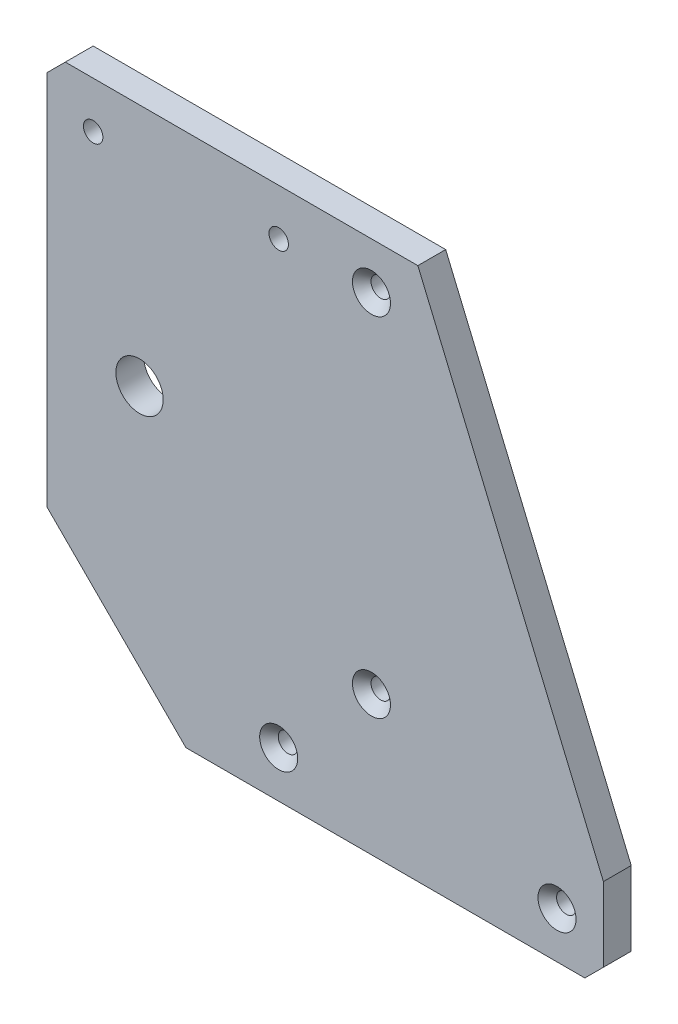
ISO-10303-21;
HEADER;
FILE_DESCRIPTION(('STEP AP214'),'2;1');
FILE_NAME('part.step','',(''),(''),'','','');
FILE_SCHEMA(('AUTOMOTIVE_DESIGN { 1 0 10303 214 1 1 1 1 }'));
ENDSEC;
DATA;
#1=APPLICATION_CONTEXT('core data for automotive mechanical design processes');
#2=APPLICATION_PROTOCOL_DEFINITION('international standard','automotive_design',2000,#1);
#3=PRODUCT_CONTEXT('',#1,'mechanical');
#4=PRODUCT('Part','Part','',(#3));
#5=PRODUCT_RELATED_PRODUCT_CATEGORY('part','',(#4));
#6=PRODUCT_DEFINITION_FORMATION('','',#4);
#7=PRODUCT_DEFINITION_CONTEXT('part definition',#1,'design');
#8=PRODUCT_DEFINITION('design','',#6,#7);
#9=PRODUCT_DEFINITION_SHAPE('','',#8);
#10=(LENGTH_UNIT() NAMED_UNIT(*) SI_UNIT(.MILLI.,.METRE.));
#11=(NAMED_UNIT(*) PLANE_ANGLE_UNIT() SI_UNIT($,.RADIAN.));
#12=(NAMED_UNIT(*) SI_UNIT($,.STERADIAN.) SOLID_ANGLE_UNIT());
#13=UNCERTAINTY_MEASURE_WITH_UNIT(LENGTH_MEASURE(1.E-05),#10,'distance_accuracy_value','');
#14=(GEOMETRIC_REPRESENTATION_CONTEXT(3) GLOBAL_UNCERTAINTY_ASSIGNED_CONTEXT((#13)) GLOBAL_UNIT_ASSIGNED_CONTEXT((#10,
#11,#12)) REPRESENTATION_CONTEXT('',''));
#15=CARTESIAN_POINT('',(0.,0.,0.));
#16=DIRECTION('',(0.,0.,1.));
#17=DIRECTION('',(1.,0.,0.));
#18=AXIS2_PLACEMENT_3D('',#15,#16,#17);
#19=CARTESIAN_POINT('',(0.,0.,3.));
#20=DIRECTION('',(0.,0.,1.));
#21=DIRECTION('',(1.,0.,0.));
#22=AXIS2_PLACEMENT_3D('',#19,#20,#21);
#23=PLANE('',#22);
#24=CARTESIAN_POINT('',(50.,42.5,3.));
#25=DIRECTION('',(0.,0.,1.));
#26=DIRECTION('',(1.,0.,0.));
#27=AXIS2_PLACEMENT_3D('',#24,#25,#26);
#28=CIRCLE('',#27,4.10000000000001);
#29=CARTESIAN_POINT('',(54.1,42.5,3.));
#30=VERTEX_POINT('',#29);
#31=EDGE_CURVE('E180',#30,#30,#28,.F.);
#32=ORIENTED_EDGE('',*,*,#31,.T.);
#33=EDGE_LOOP('',(#32));
#34=FACE_BOUND('',#33,.T.);
#35=CARTESIAN_POINT('',(30.,-52.5,3.));
#36=DIRECTION('',(0.,0.,1.));
#37=DIRECTION('',(1.,0.,0.));
#38=AXIS2_PLACEMENT_3D('',#35,#36,#37);
#39=CIRCLE('',#38,4.10000000000001);
#40=CARTESIAN_POINT('',(34.1,-52.5,3.));
#41=VERTEX_POINT('',#40);
#42=EDGE_CURVE('E177',#41,#41,#39,.F.);
#43=ORIENTED_EDGE('',*,*,#42,.T.);
#44=EDGE_LOOP('',(#43));
#45=FACE_BOUND('',#44,.T.);
#46=CARTESIAN_POINT('',(50.,-32.5,3.));
#47=DIRECTION('',(0.,0.,1.));
#48=DIRECTION('',(1.,0.,0.));
#49=AXIS2_PLACEMENT_3D('',#46,#47,#48);
#50=CIRCLE('',#49,4.10000000000001);
#51=CARTESIAN_POINT('',(54.1,-32.5,3.));
#52=VERTEX_POINT('',#51);
#53=EDGE_CURVE('E174',#52,#52,#50,.F.);
#54=ORIENTED_EDGE('',*,*,#53,.T.);
#55=EDGE_LOOP('',(#54));
#56=FACE_BOUND('',#55,.T.);
#57=CARTESIAN_POINT('',(90.,-52.5,3.));
#58=DIRECTION('',(0.,0.,1.));
#59=DIRECTION('',(1.,0.,0.));
#60=AXIS2_PLACEMENT_3D('',#57,#58,#59);
#61=CIRCLE('',#60,4.10000000000005);
#62=CARTESIAN_POINT('',(94.1000000000001,-52.5,3.));
#63=VERTEX_POINT('',#62);
#64=EDGE_CURVE('E171',#63,#63,#61,.F.);
#65=ORIENTED_EDGE('',*,*,#64,.T.);
#66=EDGE_LOOP('',(#65));
#67=FACE_BOUND('',#66,.T.);
#68=CARTESIAN_POINT('',(-10.,42.5,3.));
#69=DIRECTION('',(0.,0.,1.));
#70=DIRECTION('',(1.,0.,0.));
#71=AXIS2_PLACEMENT_3D('',#68,#69,#70);
#72=CIRCLE('',#71,2.1);
#73=CARTESIAN_POINT('',(-7.90000000000001,42.5,3.));
#74=VERTEX_POINT('',#73);
#75=EDGE_CURVE('E351',#74,#74,#72,.T.);
#76=ORIENTED_EDGE('',*,*,#75,.F.);
#77=EDGE_LOOP('',(#76));
#78=FACE_BOUND('',#77,.T.);
#79=CARTESIAN_POINT('',(30.,42.5,3.));
#80=DIRECTION('',(0.,0.,1.));
#81=DIRECTION('',(1.,0.,0.));
#82=AXIS2_PLACEMENT_3D('',#79,#80,#81);
#83=CIRCLE('',#82,2.1);
#84=CARTESIAN_POINT('',(32.1,42.5,3.));
#85=VERTEX_POINT('',#84);
#86=EDGE_CURVE('E283',#85,#85,#83,.T.);
#87=ORIENTED_EDGE('',*,*,#86,.F.);
#88=EDGE_LOOP('',(#87));
#89=FACE_BOUND('',#88,.T.);
#90=DIRECTION('',(-1.,0.,0.));
#91=VECTOR('',#90,1.);
#92=CARTESIAN_POINT('',(60.,52.5,3.));
#93=LINE('',#92,#91);
#94=CARTESIAN_POINT('',(60.,52.5,3.));
#95=VERTEX_POINT('',#94);
#96=CARTESIAN_POINT('',(-16.,52.5,3.));
#97=VERTEX_POINT('',#96);
#98=EDGE_CURVE('E141',#95,#97,#93,.T.);
#99=ORIENTED_EDGE('',*,*,#98,.T.);
#100=DIRECTION('',(0.707106781186548,0.707106781186548,0.));
#101=VECTOR('',#100,1.);
#102=CARTESIAN_POINT('',(-34.25,34.25,3.));
#103=LINE('',#102,#101);
#104=CARTESIAN_POINT('',(-20.,48.5,3.));
#105=VERTEX_POINT('',#104);
#106=EDGE_CURVE('E163',#97,#105,#103,.F.);
#107=ORIENTED_EDGE('',*,*,#106,.T.);
#108=DIRECTION('',(0.,-1.,0.));
#109=VECTOR('',#108,1.);
#110=CARTESIAN_POINT('',(-20.,52.5,3.));
#111=LINE('',#110,#109);
#112=CARTESIAN_POINT('',(-20.,-32.4999999999999,3.));
#113=VERTEX_POINT('',#112);
#114=EDGE_CURVE('E306',#105,#113,#111,.T.);
#115=ORIENTED_EDGE('',*,*,#114,.T.);
#116=DIRECTION('',(-0.707106781186547,0.707106781186548,0.));
#117=VECTOR('',#116,1.);
#118=CARTESIAN_POINT('',(-26.25,-26.2499999999999,3.));
#119=LINE('',#118,#117);
#120=CARTESIAN_POINT('',(10.,-62.5,3.));
#121=VERTEX_POINT('',#120);
#122=EDGE_CURVE('E151',#113,#121,#119,.F.);
#123=ORIENTED_EDGE('',*,*,#122,.T.);
#124=DIRECTION('',(1.,0.,0.));
#125=VECTOR('',#124,1.);
#126=CARTESIAN_POINT('',(-20.,-62.5,3.));
#127=LINE('',#126,#125);
#128=CARTESIAN_POINT('',(96.,-62.5,3.));
#129=VERTEX_POINT('',#128);
#130=EDGE_CURVE('E112',#121,#129,#127,.T.);
#131=ORIENTED_EDGE('',*,*,#130,.T.);
#132=DIRECTION('',(-0.707106781186548,-0.707106781186548,0.));
#133=VECTOR('',#132,1.);
#134=CARTESIAN_POINT('',(79.25,-79.25,3.));
#135=LINE('',#134,#133);
#136=CARTESIAN_POINT('',(100.,-58.5,3.));
#137=VERTEX_POINT('',#136);
#138=EDGE_CURVE('E53',#129,#137,#135,.F.);
#139=ORIENTED_EDGE('',*,*,#138,.T.);
#140=DIRECTION('',(0.,1.,0.));
#141=VECTOR('',#140,1.);
#142=CARTESIAN_POINT('',(100.,-62.5,3.));
#143=LINE('',#142,#141);
#144=CARTESIAN_POINT('',(100.,-42.5,3.));
#145=VERTEX_POINT('',#144);
#146=EDGE_CURVE('E102',#137,#145,#143,.T.);
#147=ORIENTED_EDGE('',*,*,#146,.T.);
#148=DIRECTION('',(-0.388057000058133,0.921635375138065,0.));
#149=VECTOR('',#148,1.);
#150=CARTESIAN_POINT('',(100.,-42.5,3.));
#151=LINE('',#150,#149);
#152=EDGE_CURVE('E107',#145,#95,#151,.T.);
#153=ORIENTED_EDGE('',*,*,#152,.T.);
#154=EDGE_LOOP('',(#99,#107,#115,#123,#131,#139,#147,#153));
#155=FACE_BOUND('',#154,.T.);
#156=CARTESIAN_POINT('',(0.,0.,3.));
#157=DIRECTION('',(0.,0.,1.));
#158=DIRECTION('',(1.,0.,0.));
#159=AXIS2_PLACEMENT_3D('',#156,#157,#158);
#160=CIRCLE('',#159,5.1);
#161=CARTESIAN_POINT('',(5.1,0.,3.));
#162=VERTEX_POINT('',#161);
#163=EDGE_CURVE('E135',#162,#162,#160,.T.);
#164=ORIENTED_EDGE('',*,*,#163,.F.);
#165=EDGE_LOOP('',(#164));
#166=FACE_BOUND('',#165,.T.);
#167=ADVANCED_FACE('F37',(#34,#45,#56,#67,#78,#89,#155,#166),#23,.T.);
#168=CARTESIAN_POINT('',(0.,0.,-3.));
#169=DIRECTION('',(0.,0.,1.));
#170=DIRECTION('',(1.,0.,0.));
#171=AXIS2_PLACEMENT_3D('',#168,#169,#170);
#172=PLANE('',#171);
#173=CARTESIAN_POINT('',(-10.,42.5,-3.));
#174=DIRECTION('',(0.,0.,1.));
#175=DIRECTION('',(1.,0.,0.));
#176=AXIS2_PLACEMENT_3D('',#173,#174,#175);
#177=CIRCLE('',#176,2.1);
#178=CARTESIAN_POINT('',(-7.90000000000001,42.5,-3.));
#179=VERTEX_POINT('',#178);
#180=EDGE_CURVE('E304',#179,#179,#177,.T.);
#181=ORIENTED_EDGE('',*,*,#180,.T.);
#182=EDGE_LOOP('',(#181));
#183=FACE_BOUND('',#182,.T.);
#184=CARTESIAN_POINT('',(30.,42.5,-3.));
#185=DIRECTION('',(0.,0.,1.));
#186=DIRECTION('',(1.,0.,0.));
#187=AXIS2_PLACEMENT_3D('',#184,#185,#186);
#188=CIRCLE('',#187,2.1);
#189=CARTESIAN_POINT('',(32.1,42.5,-3.));
#190=VERTEX_POINT('',#189);
#191=EDGE_CURVE('E287',#190,#190,#188,.T.);
#192=ORIENTED_EDGE('',*,*,#191,.T.);
#193=EDGE_LOOP('',(#192));
#194=FACE_BOUND('',#193,.T.);
#195=CARTESIAN_POINT('',(50.,42.5,-3.));
#196=DIRECTION('',(0.,0.,1.));
#197=DIRECTION('',(1.,0.,0.));
#198=AXIS2_PLACEMENT_3D('',#195,#196,#197);
#199=CIRCLE('',#198,2.1);
#200=CARTESIAN_POINT('',(52.1,42.5,-3.));
#201=VERTEX_POINT('',#200);
#202=EDGE_CURVE('E281',#201,#201,#199,.T.);
#203=ORIENTED_EDGE('',*,*,#202,.T.);
#204=EDGE_LOOP('',(#203));
#205=FACE_BOUND('',#204,.T.);
#206=CARTESIAN_POINT('',(50.,-32.5,-3.));
#207=DIRECTION('',(0.,0.,1.));
#208=DIRECTION('',(1.,0.,0.));
#209=AXIS2_PLACEMENT_3D('',#206,#207,#208);
#210=CIRCLE('',#209,2.1);
#211=CARTESIAN_POINT('',(52.1,-32.5,-3.));
#212=VERTEX_POINT('',#211);
#213=EDGE_CURVE('E284',#212,#212,#210,.T.);
#214=ORIENTED_EDGE('',*,*,#213,.T.);
#215=EDGE_LOOP('',(#214));
#216=FACE_BOUND('',#215,.T.);
#217=CARTESIAN_POINT('',(30.,-52.5,-3.));
#218=DIRECTION('',(0.,0.,1.));
#219=DIRECTION('',(1.,0.,0.));
#220=AXIS2_PLACEMENT_3D('',#217,#218,#219);
#221=CIRCLE('',#220,2.1);
#222=CARTESIAN_POINT('',(32.1,-52.5,-3.));
#223=VERTEX_POINT('',#222);
#224=EDGE_CURVE('E290',#223,#223,#221,.T.);
#225=ORIENTED_EDGE('',*,*,#224,.T.);
#226=EDGE_LOOP('',(#225));
#227=FACE_BOUND('',#226,.T.);
#228=CARTESIAN_POINT('',(90.,-52.5,-3.));
#229=DIRECTION('',(0.,0.,1.));
#230=DIRECTION('',(1.,0.,0.));
#231=AXIS2_PLACEMENT_3D('',#228,#229,#230);
#232=CIRCLE('',#231,2.1);
#233=CARTESIAN_POINT('',(92.1,-52.5,-3.));
#234=VERTEX_POINT('',#233);
#235=EDGE_CURVE('E296',#234,#234,#232,.T.);
#236=ORIENTED_EDGE('',*,*,#235,.T.);
#237=EDGE_LOOP('',(#236));
#238=FACE_BOUND('',#237,.T.);
#239=DIRECTION('',(0.,-1.,0.));
#240=VECTOR('',#239,1.);
#241=CARTESIAN_POINT('',(-20.,52.5,-3.));
#242=LINE('',#241,#240);
#243=CARTESIAN_POINT('',(-20.,48.5,-3.));
#244=VERTEX_POINT('',#243);
#245=CARTESIAN_POINT('',(-20.,-32.4999999999999,-3.));
#246=VERTEX_POINT('',#245);
#247=EDGE_CURVE('E134',#244,#246,#242,.T.);
#248=ORIENTED_EDGE('',*,*,#247,.F.);
#249=DIRECTION('',(-0.707106781186548,-0.707106781186548,0.));
#250=VECTOR('',#249,1.);
#251=CARTESIAN_POINT('',(-20.,48.5,-3.));
#252=LINE('',#251,#250);
#253=CARTESIAN_POINT('',(-16.,52.5,-3.));
#254=VERTEX_POINT('',#253);
#255=EDGE_CURVE('E158',#244,#254,#252,.F.);
#256=ORIENTED_EDGE('',*,*,#255,.T.);
#257=DIRECTION('',(-1.,0.,0.));
#258=VECTOR('',#257,1.);
#259=CARTESIAN_POINT('',(60.,52.5,-3.));
#260=LINE('',#259,#258);
#261=CARTESIAN_POINT('',(60.,52.5,-3.));
#262=VERTEX_POINT('',#261);
#263=EDGE_CURVE('E131',#262,#254,#260,.T.);
#264=ORIENTED_EDGE('',*,*,#263,.F.);
#265=DIRECTION('',(-0.388057000058133,0.921635375138065,0.));
#266=VECTOR('',#265,1.);
#267=CARTESIAN_POINT('',(100.,-42.5,-3.));
#268=LINE('',#267,#266);
#269=CARTESIAN_POINT('',(100.,-42.5,-3.));
#270=VERTEX_POINT('',#269);
#271=EDGE_CURVE('E140',#270,#262,#268,.T.);
#272=ORIENTED_EDGE('',*,*,#271,.F.);
#273=DIRECTION('',(0.,1.,0.));
#274=VECTOR('',#273,1.);
#275=CARTESIAN_POINT('',(100.,-62.5,-3.));
#276=LINE('',#275,#274);
#277=CARTESIAN_POINT('',(100.,-58.5,-3.));
#278=VERTEX_POINT('',#277);
#279=EDGE_CURVE('E118',#278,#270,#276,.T.);
#280=ORIENTED_EDGE('',*,*,#279,.F.);
#281=DIRECTION('',(0.707106781186548,0.707106781186548,0.));
#282=VECTOR('',#281,1.);
#283=CARTESIAN_POINT('',(100.,-58.5,-3.));
#284=LINE('',#283,#282);
#285=CARTESIAN_POINT('',(96.,-62.5,-3.));
#286=VERTEX_POINT('',#285);
#287=EDGE_CURVE('E156',#278,#286,#284,.F.);
#288=ORIENTED_EDGE('',*,*,#287,.T.);
#289=DIRECTION('',(1.,0.,0.));
#290=VECTOR('',#289,1.);
#291=CARTESIAN_POINT('',(-20.,-62.5,-3.));
#292=LINE('',#291,#290);
#293=CARTESIAN_POINT('',(10.,-62.5,-3.));
#294=VERTEX_POINT('',#293);
#295=EDGE_CURVE('E137',#294,#286,#292,.T.);
#296=ORIENTED_EDGE('',*,*,#295,.F.);
#297=DIRECTION('',(0.707106781186547,-0.707106781186548,0.));
#298=VECTOR('',#297,1.);
#299=CARTESIAN_POINT('',(10.,-62.5,-3.));
#300=LINE('',#299,#298);
#301=EDGE_CURVE('E145',#294,#246,#300,.F.);
#302=ORIENTED_EDGE('',*,*,#301,.T.);
#303=EDGE_LOOP('',(#248,#256,#264,#272,#280,#288,#296,#302));
#304=FACE_BOUND('',#303,.T.);
#305=CARTESIAN_POINT('',(0.,0.,-3.));
#306=DIRECTION('',(0.,0.,1.));
#307=DIRECTION('',(1.,0.,0.));
#308=AXIS2_PLACEMENT_3D('',#305,#306,#307);
#309=CIRCLE('',#308,5.1);
#310=CARTESIAN_POINT('',(5.1,0.,-3.));
#311=VERTEX_POINT('',#310);
#312=EDGE_CURVE('E301',#311,#311,#309,.T.);
#313=ORIENTED_EDGE('',*,*,#312,.T.);
#314=EDGE_LOOP('',(#313));
#315=FACE_BOUND('',#314,.T.);
#316=ADVANCED_FACE('F206',(#183,#194,#205,#216,#227,#238,#304,#315),#172,.F.);
#317=CARTESIAN_POINT('',(60.,52.5,3.));
#318=DIRECTION('',(0.,-1.,0.));
#319=DIRECTION('',(1.,0.,0.));
#320=AXIS2_PLACEMENT_3D('',#317,#318,#319);
#321=PLANE('',#320);
#322=ORIENTED_EDGE('',*,*,#263,.T.);
#323=DIRECTION('',(0.,0.,1.));
#324=VECTOR('',#323,1.);
#325=CARTESIAN_POINT('',(-16.,52.5,3.));
#326=LINE('',#325,#324);
#327=EDGE_CURVE('E160',#254,#97,#326,.T.);
#328=ORIENTED_EDGE('',*,*,#327,.T.);
#329=ORIENTED_EDGE('',*,*,#98,.F.);
#330=DIRECTION('',(0.,0.,-1.));
#331=VECTOR('',#330,1.);
#332=CARTESIAN_POINT('',(60.,52.5,3.));
#333=LINE('',#332,#331);
#334=EDGE_CURVE('E122',#95,#262,#333,.T.);
#335=ORIENTED_EDGE('',*,*,#334,.T.);
#336=EDGE_LOOP('',(#322,#328,#329,#335));
#337=FACE_BOUND('',#336,.T.);
#338=ADVANCED_FACE('F212',(#337),#321,.F.);
#339=CARTESIAN_POINT('',(-20.,52.5,3.));
#340=DIRECTION('',(1.,0.,0.));
#341=DIRECTION('',(0.,1.,0.));
#342=AXIS2_PLACEMENT_3D('',#339,#340,#341);
#343=PLANE('',#342);
#344=ORIENTED_EDGE('',*,*,#114,.F.);
#345=DIRECTION('',(0.,0.,-1.));
#346=VECTOR('',#345,1.);
#347=CARTESIAN_POINT('',(-20.,48.5,3.));
#348=LINE('',#347,#346);
#349=EDGE_CURVE('E153',#105,#244,#348,.T.);
#350=ORIENTED_EDGE('',*,*,#349,.T.);
#351=ORIENTED_EDGE('',*,*,#247,.T.);
#352=DIRECTION('',(0.,0.,1.));
#353=VECTOR('',#352,1.);
#354=CARTESIAN_POINT('',(-20.,-32.4999999999999,3.));
#355=LINE('',#354,#353);
#356=EDGE_CURVE('E148',#246,#113,#355,.T.);
#357=ORIENTED_EDGE('',*,*,#356,.T.);
#358=EDGE_LOOP('',(#344,#350,#351,#357));
#359=FACE_BOUND('',#358,.T.);
#360=ADVANCED_FACE('F227',(#359),#343,.F.);
#361=CARTESIAN_POINT('',(-20.,-62.5,3.));
#362=DIRECTION('',(0.,1.,0.));
#363=DIRECTION('',(0.,0.,1.));
#364=AXIS2_PLACEMENT_3D('',#361,#362,#363);
#365=PLANE('',#364);
#366=ORIENTED_EDGE('',*,*,#295,.T.);
#367=DIRECTION('',(0.,0.,1.));
#368=VECTOR('',#367,1.);
#369=CARTESIAN_POINT('',(96.,-62.5,3.));
#370=LINE('',#369,#368);
#371=EDGE_CURVE('E61',#286,#129,#370,.T.);
#372=ORIENTED_EDGE('',*,*,#371,.T.);
#373=ORIENTED_EDGE('',*,*,#130,.F.);
#374=DIRECTION('',(0.,0.,-1.));
#375=VECTOR('',#374,1.);
#376=CARTESIAN_POINT('',(10.,-62.5,3.));
#377=LINE('',#376,#375);
#378=EDGE_CURVE('E121',#121,#294,#377,.T.);
#379=ORIENTED_EDGE('',*,*,#378,.T.);
#380=EDGE_LOOP('',(#366,#372,#373,#379));
#381=FACE_BOUND('',#380,.T.);
#382=ADVANCED_FACE('F224',(#381),#365,.F.);
#383=CARTESIAN_POINT('',(100.,-62.5,3.));
#384=DIRECTION('',(-1.,0.,0.));
#385=DIRECTION('',(0.,0.,1.));
#386=AXIS2_PLACEMENT_3D('',#383,#384,#385);
#387=PLANE('',#386);
#388=ORIENTED_EDGE('',*,*,#146,.F.);
#389=DIRECTION('',(0.,0.,-1.));
#390=VECTOR('',#389,1.);
#391=CARTESIAN_POINT('',(100.,-58.5,3.));
#392=LINE('',#391,#390);
#393=EDGE_CURVE('E165',#137,#278,#392,.T.);
#394=ORIENTED_EDGE('',*,*,#393,.T.);
#395=ORIENTED_EDGE('',*,*,#279,.T.);
#396=DIRECTION('',(0.,0.,-1.));
#397=VECTOR('',#396,1.);
#398=CARTESIAN_POINT('',(100.,-42.5,3.));
#399=LINE('',#398,#397);
#400=EDGE_CURVE('E115',#145,#270,#399,.T.);
#401=ORIENTED_EDGE('',*,*,#400,.F.);
#402=EDGE_LOOP('',(#388,#394,#395,#401));
#403=FACE_BOUND('',#402,.T.);
#404=ADVANCED_FACE('F116',(#403),#387,.F.);
#405=CARTESIAN_POINT('',(100.,-42.5,3.));
#406=DIRECTION('',(-0.921635375138065,-0.388057000058133,0.));
#407=DIRECTION('',(0.388057000058133,-0.921635375138065,0.));
#408=AXIS2_PLACEMENT_3D('',#405,#406,#407);
#409=PLANE('',#408);
#410=ORIENTED_EDGE('',*,*,#271,.T.);
#411=ORIENTED_EDGE('',*,*,#334,.F.);
#412=ORIENTED_EDGE('',*,*,#152,.F.);
#413=ORIENTED_EDGE('',*,*,#400,.T.);
#414=EDGE_LOOP('',(#410,#411,#412,#413));
#415=FACE_BOUND('',#414,.T.);
#416=ADVANCED_FACE('F124',(#415),#409,.F.);
#417=CARTESIAN_POINT('',(0.,0.,3.));
#418=DIRECTION('',(0.,0.,-1.));
#419=DIRECTION('',(-1.,0.,0.));
#420=AXIS2_PLACEMENT_3D('',#417,#418,#419);
#421=CYLINDRICAL_SURFACE('',#420,5.1);
#422=ORIENTED_EDGE('',*,*,#163,.T.);
#423=EDGE_LOOP('',(#422));
#424=FACE_BOUND('',#423,.T.);
#425=ORIENTED_EDGE('',*,*,#312,.F.);
#426=EDGE_LOOP('',(#425));
#427=FACE_BOUND('',#426,.T.);
#428=ADVANCED_FACE('F217',(#424,#427),#421,.F.);
#429=CARTESIAN_POINT('',(90.,-52.5,-3.));
#430=DIRECTION('',(0.,0.,1.));
#431=DIRECTION('',(1.,0.,0.));
#432=AXIS2_PLACEMENT_3D('',#429,#430,#431);
#433=CYLINDRICAL_SURFACE('',#432,2.1);
#434=CARTESIAN_POINT('',(90.,-52.5,0.999999999999977));
#435=DIRECTION('',(0.,0.,1.));
#436=DIRECTION('',(1.,0.,0.));
#437=AXIS2_PLACEMENT_3D('',#434,#435,#436);
#438=CIRCLE('',#437,2.1);
#439=CARTESIAN_POINT('',(92.1,-52.5,0.999999999999977));
#440=VERTEX_POINT('',#439);
#441=EDGE_CURVE('E11',#440,#440,#438,.T.);
#442=ORIENTED_EDGE('',*,*,#441,.T.);
#443=EDGE_LOOP('',(#442));
#444=FACE_BOUND('',#443,.T.);
#445=ORIENTED_EDGE('',*,*,#235,.F.);
#446=EDGE_LOOP('',(#445));
#447=FACE_BOUND('',#446,.T.);
#448=ADVANCED_FACE('F322',(#444,#447),#433,.F.);
#449=CARTESIAN_POINT('',(30.,-52.5,-3.));
#450=DIRECTION('',(0.,0.,1.));
#451=DIRECTION('',(1.,0.,0.));
#452=AXIS2_PLACEMENT_3D('',#449,#450,#451);
#453=CYLINDRICAL_SURFACE('',#452,2.1);
#454=CARTESIAN_POINT('',(30.,-52.5,0.999999999999997));
#455=DIRECTION('',(0.,0.,1.));
#456=DIRECTION('',(1.,0.,0.));
#457=AXIS2_PLACEMENT_3D('',#454,#455,#456);
#458=CIRCLE('',#457,2.1);
#459=CARTESIAN_POINT('',(32.1,-52.5,0.999999999999997));
#460=VERTEX_POINT('',#459);
#461=EDGE_CURVE('E183',#460,#460,#458,.T.);
#462=ORIENTED_EDGE('',*,*,#461,.T.);
#463=EDGE_LOOP('',(#462));
#464=FACE_BOUND('',#463,.T.);
#465=ORIENTED_EDGE('',*,*,#224,.F.);
#466=EDGE_LOOP('',(#465));
#467=FACE_BOUND('',#466,.T.);
#468=ADVANCED_FACE('F327',(#464,#467),#453,.F.);
#469=CARTESIAN_POINT('',(50.,-32.5,-3.));
#470=DIRECTION('',(0.,0.,1.));
#471=DIRECTION('',(1.,0.,0.));
#472=AXIS2_PLACEMENT_3D('',#469,#470,#471);
#473=CYLINDRICAL_SURFACE('',#472,2.1);
#474=CARTESIAN_POINT('',(50.,-32.5,0.999999999999997));
#475=DIRECTION('',(0.,0.,1.));
#476=DIRECTION('',(1.,0.,0.));
#477=AXIS2_PLACEMENT_3D('',#474,#475,#476);
#478=CIRCLE('',#477,2.1);
#479=CARTESIAN_POINT('',(52.1,-32.5,0.999999999999997));
#480=VERTEX_POINT('',#479);
#481=EDGE_CURVE('E46',#480,#480,#478,.T.);
#482=ORIENTED_EDGE('',*,*,#481,.T.);
#483=EDGE_LOOP('',(#482));
#484=FACE_BOUND('',#483,.T.);
#485=ORIENTED_EDGE('',*,*,#213,.F.);
#486=EDGE_LOOP('',(#485));
#487=FACE_BOUND('',#486,.T.);
#488=ADVANCED_FACE('F188',(#484,#487),#473,.F.);
#489=CARTESIAN_POINT('',(50.,42.5,-3.));
#490=DIRECTION('',(0.,0.,1.));
#491=DIRECTION('',(1.,0.,0.));
#492=AXIS2_PLACEMENT_3D('',#489,#490,#491);
#493=CYLINDRICAL_SURFACE('',#492,2.1);
#494=CARTESIAN_POINT('',(50.,42.5,0.999999999999997));
#495=DIRECTION('',(0.,0.,1.));
#496=DIRECTION('',(1.,0.,0.));
#497=AXIS2_PLACEMENT_3D('',#494,#495,#496);
#498=CIRCLE('',#497,2.1);
#499=CARTESIAN_POINT('',(52.1,42.5,0.999999999999997));
#500=VERTEX_POINT('',#499);
#501=EDGE_CURVE('E168',#500,#500,#498,.T.);
#502=ORIENTED_EDGE('',*,*,#501,.T.);
#503=EDGE_LOOP('',(#502));
#504=FACE_BOUND('',#503,.T.);
#505=ORIENTED_EDGE('',*,*,#202,.F.);
#506=EDGE_LOOP('',(#505));
#507=FACE_BOUND('',#506,.T.);
#508=ADVANCED_FACE('F274',(#504,#507),#493,.F.);
#509=CARTESIAN_POINT('',(30.,42.5,-3.));
#510=DIRECTION('',(0.,0.,1.));
#511=DIRECTION('',(1.,0.,0.));
#512=AXIS2_PLACEMENT_3D('',#509,#510,#511);
#513=CYLINDRICAL_SURFACE('',#512,2.1);
#514=ORIENTED_EDGE('',*,*,#191,.F.);
#515=EDGE_LOOP('',(#514));
#516=FACE_BOUND('',#515,.T.);
#517=ORIENTED_EDGE('',*,*,#86,.T.);
#518=EDGE_LOOP('',(#517));
#519=FACE_BOUND('',#518,.T.);
#520=ADVANCED_FACE('F277',(#516,#519),#513,.F.);
#521=CARTESIAN_POINT('',(-10.,42.5,-3.));
#522=DIRECTION('',(0.,0.,1.));
#523=DIRECTION('',(1.,0.,0.));
#524=AXIS2_PLACEMENT_3D('',#521,#522,#523);
#525=CYLINDRICAL_SURFACE('',#524,2.1);
#526=ORIENTED_EDGE('',*,*,#180,.F.);
#527=EDGE_LOOP('',(#526));
#528=FACE_BOUND('',#527,.T.);
#529=ORIENTED_EDGE('',*,*,#75,.T.);
#530=EDGE_LOOP('',(#529));
#531=FACE_BOUND('',#530,.T.);
#532=ADVANCED_FACE('F242',(#528,#531),#525,.F.);
#533=CARTESIAN_POINT('',(10.,-62.5,3.));
#534=DIRECTION('',(0.707106781186548,0.707106781186547,0.));
#535=DIRECTION('',(0.,0.,-1.));
#536=AXIS2_PLACEMENT_3D('',#533,#534,#535);
#537=PLANE('',#536);
#538=ORIENTED_EDGE('',*,*,#122,.F.);
#539=ORIENTED_EDGE('',*,*,#356,.F.);
#540=ORIENTED_EDGE('',*,*,#301,.F.);
#541=ORIENTED_EDGE('',*,*,#378,.F.);
#542=EDGE_LOOP('',(#538,#539,#540,#541));
#543=FACE_BOUND('',#542,.T.);
#544=ADVANCED_FACE('F235',(#543),#537,.F.);
#545=CARTESIAN_POINT('',(-20.,48.5,3.));
#546=DIRECTION('',(0.707106781186548,-0.707106781186548,0.));
#547=DIRECTION('',(0.,0.,-1.));
#548=AXIS2_PLACEMENT_3D('',#545,#546,#547);
#549=PLANE('',#548);
#550=ORIENTED_EDGE('',*,*,#106,.F.);
#551=ORIENTED_EDGE('',*,*,#327,.F.);
#552=ORIENTED_EDGE('',*,*,#255,.F.);
#553=ORIENTED_EDGE('',*,*,#349,.F.);
#554=EDGE_LOOP('',(#550,#551,#552,#553));
#555=FACE_BOUND('',#554,.T.);
#556=ADVANCED_FACE('F241',(#555),#549,.F.);
#557=CARTESIAN_POINT('',(100.,-58.5,3.));
#558=DIRECTION('',(-0.707106781186547,0.707106781186547,0.));
#559=DIRECTION('',(0.,0.,-1.));
#560=AXIS2_PLACEMENT_3D('',#557,#558,#559);
#561=PLANE('',#560);
#562=ORIENTED_EDGE('',*,*,#138,.F.);
#563=ORIENTED_EDGE('',*,*,#371,.F.);
#564=ORIENTED_EDGE('',*,*,#287,.F.);
#565=ORIENTED_EDGE('',*,*,#393,.F.);
#566=EDGE_LOOP('',(#562,#563,#564,#565));
#567=FACE_BOUND('',#566,.T.);
#568=ADVANCED_FACE('F249',(#567),#561,.F.);
#569=CARTESIAN_POINT('',(50.,42.5,0.999999999999997));
#570=DIRECTION('',(0.,0.,1.));
#571=DIRECTION('',(1.,0.,0.));
#572=AXIS2_PLACEMENT_3D('',#569,#570,#571);
#573=CONICAL_SURFACE('',#572,2.1,0.78539816339745);
#574=ORIENTED_EDGE('',*,*,#31,.F.);
#575=EDGE_LOOP('',(#574));
#576=FACE_BOUND('',#575,.T.);
#577=ORIENTED_EDGE('',*,*,#501,.F.);
#578=EDGE_LOOP('',(#577));
#579=FACE_BOUND('',#578,.T.);
#580=ADVANCED_FACE('F200',(#576,#579),#573,.F.);
#581=CARTESIAN_POINT('',(30.,-52.5,0.999999999999997));
#582=DIRECTION('',(0.,0.,1.));
#583=DIRECTION('',(1.,0.,0.));
#584=AXIS2_PLACEMENT_3D('',#581,#582,#583);
#585=CONICAL_SURFACE('',#584,2.1,0.78539816339745);
#586=ORIENTED_EDGE('',*,*,#42,.F.);
#587=EDGE_LOOP('',(#586));
#588=FACE_BOUND('',#587,.T.);
#589=ORIENTED_EDGE('',*,*,#461,.F.);
#590=EDGE_LOOP('',(#589));
#591=FACE_BOUND('',#590,.T.);
#592=ADVANCED_FACE('F193',(#588,#591),#585,.F.);
#593=CARTESIAN_POINT('',(50.,-32.5,0.999999999999997));
#594=DIRECTION('',(0.,0.,1.));
#595=DIRECTION('',(1.,0.,0.));
#596=AXIS2_PLACEMENT_3D('',#593,#594,#595);
#597=CONICAL_SURFACE('',#596,2.1,0.78539816339745);
#598=ORIENTED_EDGE('',*,*,#53,.F.);
#599=EDGE_LOOP('',(#598));
#600=FACE_BOUND('',#599,.T.);
#601=ORIENTED_EDGE('',*,*,#481,.F.);
#602=EDGE_LOOP('',(#601));
#603=FACE_BOUND('',#602,.T.);
#604=ADVANCED_FACE('F191',(#600,#603),#597,.F.);
#605=CARTESIAN_POINT('',(90.,-52.5,0.999999999999977));
#606=DIRECTION('',(0.,0.,1.));
#607=DIRECTION('',(1.,0.,0.));
#608=AXIS2_PLACEMENT_3D('',#605,#606,#607);
#609=CONICAL_SURFACE('',#608,2.1,0.785398163397453);
#610=ORIENTED_EDGE('',*,*,#64,.F.);
#611=EDGE_LOOP('',(#610));
#612=FACE_BOUND('',#611,.T.);
#613=ORIENTED_EDGE('',*,*,#441,.F.);
#614=EDGE_LOOP('',(#613));
#615=FACE_BOUND('',#614,.T.);
#616=ADVANCED_FACE('F40',(#612,#615),#609,.F.);
#617=CLOSED_SHELL('',(#167,#316,#338,#360,#382,#404,#416,#428,#448,#468,#488,#508,#520,#532,
#544,#556,#568,#580,#592,#604,#616));
#618=MANIFOLD_SOLID_BREP('B2',#617);
#619=ADVANCED_BREP_SHAPE_REPRESENTATION('',(#18,#618),#14);
#620=SHAPE_DEFINITION_REPRESENTATION(#9,#619);
ENDSEC;
END-ISO-10303-21;
